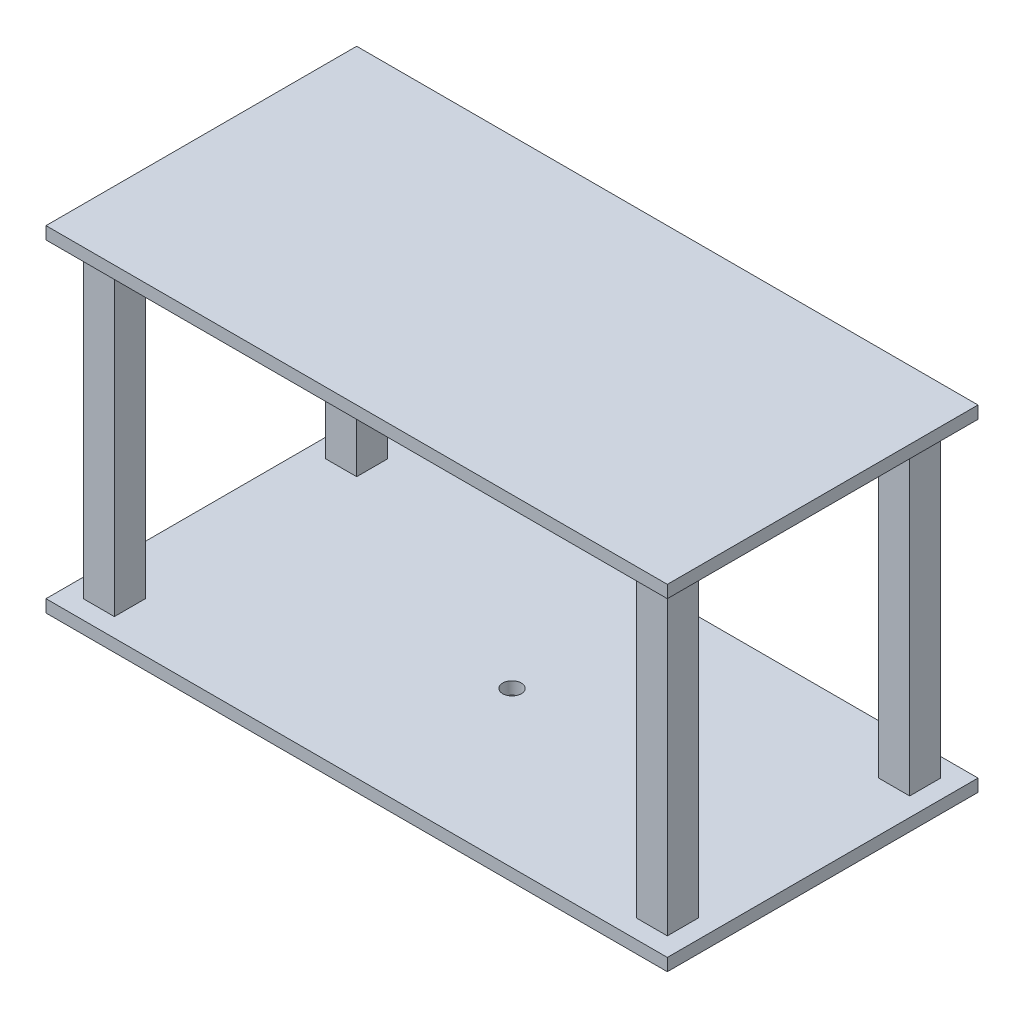
ISO-10303-21;
HEADER;
FILE_DESCRIPTION(('STEP AP214'),'2;1');
FILE_NAME('part.step','',(''),(''),'','','');
FILE_SCHEMA(('AUTOMOTIVE_DESIGN { 1 0 10303 214 1 1 1 1 }'));
ENDSEC;
DATA;
#1=APPLICATION_CONTEXT('core data for automotive mechanical design processes');
#2=APPLICATION_PROTOCOL_DEFINITION('international standard','automotive_design',2000,#1);
#3=PRODUCT_CONTEXT('',#1,'mechanical');
#4=PRODUCT('Part','Part','',(#3));
#5=PRODUCT_RELATED_PRODUCT_CATEGORY('part','',(#4));
#6=PRODUCT_DEFINITION_FORMATION('','',#4);
#7=PRODUCT_DEFINITION_CONTEXT('part definition',#1,'design');
#8=PRODUCT_DEFINITION('design','',#6,#7);
#9=PRODUCT_DEFINITION_SHAPE('','',#8);
#10=(LENGTH_UNIT() NAMED_UNIT(*) SI_UNIT(.MILLI.,.METRE.));
#11=(NAMED_UNIT(*) PLANE_ANGLE_UNIT() SI_UNIT($,.RADIAN.));
#12=(NAMED_UNIT(*) SI_UNIT($,.STERADIAN.) SOLID_ANGLE_UNIT());
#13=UNCERTAINTY_MEASURE_WITH_UNIT(LENGTH_MEASURE(1.E-05),#10,'distance_accuracy_value','');
#14=(GEOMETRIC_REPRESENTATION_CONTEXT(3) GLOBAL_UNCERTAINTY_ASSIGNED_CONTEXT((#13)) GLOBAL_UNIT_ASSIGNED_CONTEXT((#10,
#11,#12)) REPRESENTATION_CONTEXT('',''));
#15=CARTESIAN_POINT('',(0.,0.,0.));
#16=DIRECTION('',(0.,0.,1.));
#17=DIRECTION('',(1.,0.,0.));
#18=AXIS2_PLACEMENT_3D('',#15,#16,#17);
#19=CARTESIAN_POINT('',(0.,2.,0.));
#20=DIRECTION('',(0.,1.,0.));
#21=DIRECTION('',(0.,0.,1.));
#22=AXIS2_PLACEMENT_3D('',#19,#20,#21);
#23=PLANE('',#22);
#24=DIRECTION('',(0.,0.,-1.));
#25=VECTOR('',#24,1.);
#26=CARTESIAN_POINT('',(-47.,2.,22.));
#27=LINE('',#26,#25);
#28=CARTESIAN_POINT('',(-47.,2.,22.));
#29=VERTEX_POINT('',#28);
#30=CARTESIAN_POINT('',(-47.,2.,17.));
#31=VERTEX_POINT('',#30);
#32=EDGE_CURVE('E282',#29,#31,#27,.T.);
#33=ORIENTED_EDGE('',*,*,#32,.T.);
#34=DIRECTION('',(1.,0.,0.));
#35=VECTOR('',#34,1.);
#36=CARTESIAN_POINT('',(-47.,2.,17.));
#37=LINE('',#36,#35);
#38=CARTESIAN_POINT('',(-42.,2.,17.));
#39=VERTEX_POINT('',#38);
#40=EDGE_CURVE('E288',#31,#39,#37,.T.);
#41=ORIENTED_EDGE('',*,*,#40,.T.);
#42=DIRECTION('',(0.,0.,1.));
#43=VECTOR('',#42,1.);
#44=CARTESIAN_POINT('',(-42.,2.,22.));
#45=LINE('',#44,#43);
#46=CARTESIAN_POINT('',(-42.,2.,22.));
#47=VERTEX_POINT('',#46);
#48=EDGE_CURVE('E305',#39,#47,#45,.T.);
#49=ORIENTED_EDGE('',*,*,#48,.T.);
#50=DIRECTION('',(-1.,0.,0.));
#51=VECTOR('',#50,1.);
#52=CARTESIAN_POINT('',(-47.,2.,22.));
#53=LINE('',#52,#51);
#54=EDGE_CURVE('E68',#47,#29,#53,.T.);
#55=ORIENTED_EDGE('',*,*,#54,.T.);
#56=EDGE_LOOP('',(#33,#41,#49,#55));
#57=FACE_BOUND('',#56,.T.);
#58=DIRECTION('',(0.,0.,1.));
#59=VECTOR('',#58,1.);
#60=CARTESIAN_POINT('',(47.,2.,-22.));
#61=LINE('',#60,#59);
#62=CARTESIAN_POINT('',(47.,2.,-22.));
#63=VERTEX_POINT('',#62);
#64=CARTESIAN_POINT('',(47.,2.,-17.));
#65=VERTEX_POINT('',#64);
#66=EDGE_CURVE('E324',#63,#65,#61,.T.);
#67=ORIENTED_EDGE('',*,*,#66,.T.);
#68=DIRECTION('',(-1.,0.,0.));
#69=VECTOR('',#68,1.);
#70=CARTESIAN_POINT('',(47.,2.,-17.));
#71=LINE('',#70,#69);
#72=CARTESIAN_POINT('',(42.,2.,-17.));
#73=VERTEX_POINT('',#72);
#74=EDGE_CURVE('E330',#65,#73,#71,.T.);
#75=ORIENTED_EDGE('',*,*,#74,.T.);
#76=DIRECTION('',(0.,0.,-1.));
#77=VECTOR('',#76,1.);
#78=CARTESIAN_POINT('',(42.,2.,-22.));
#79=LINE('',#78,#77);
#80=CARTESIAN_POINT('',(42.,2.,-22.));
#81=VERTEX_POINT('',#80);
#82=EDGE_CURVE('E348',#73,#81,#79,.T.);
#83=ORIENTED_EDGE('',*,*,#82,.T.);
#84=DIRECTION('',(1.,0.,0.));
#85=VECTOR('',#84,1.);
#86=CARTESIAN_POINT('',(47.,2.,-22.));
#87=LINE('',#86,#85);
#88=EDGE_CURVE('E345',#81,#63,#87,.T.);
#89=ORIENTED_EDGE('',*,*,#88,.T.);
#90=EDGE_LOOP('',(#67,#75,#83,#89));
#91=FACE_BOUND('',#90,.T.);
#92=CARTESIAN_POINT('',(0.,2.,0.));
#93=DIRECTION('',(0.,1.,0.));
#94=DIRECTION('',(0.,0.,1.));
#95=AXIS2_PLACEMENT_3D('',#92,#93,#94);
#96=CIRCLE('',#95,1.5);
#97=CARTESIAN_POINT('',(0.,2.,1.5));
#98=VERTEX_POINT('',#97);
#99=EDGE_CURVE('E412',#98,#98,#96,.T.);
#100=ORIENTED_EDGE('',*,*,#99,.F.);
#101=EDGE_LOOP('',(#100));
#102=FACE_BOUND('',#101,.T.);
#103=DIRECTION('',(0.,0.,1.));
#104=VECTOR('',#103,1.);
#105=CARTESIAN_POINT('',(-50.,2.,-25.));
#106=LINE('',#105,#104);
#107=CARTESIAN_POINT('',(-50.,2.,-25.));
#108=VERTEX_POINT('',#107);
#109=CARTESIAN_POINT('',(-50.,2.,25.));
#110=VERTEX_POINT('',#109);
#111=EDGE_CURVE('E421',#108,#110,#106,.T.);
#112=ORIENTED_EDGE('',*,*,#111,.T.);
#113=DIRECTION('',(1.,0.,0.));
#114=VECTOR('',#113,1.);
#115=CARTESIAN_POINT('',(-50.,2.,25.));
#116=LINE('',#115,#114);
#117=CARTESIAN_POINT('',(50.,2.,25.));
#118=VERTEX_POINT('',#117);
#119=EDGE_CURVE('E425',#110,#118,#116,.T.);
#120=ORIENTED_EDGE('',*,*,#119,.T.);
#121=DIRECTION('',(0.,0.,-1.));
#122=VECTOR('',#121,1.);
#123=CARTESIAN_POINT('',(50.,2.,-25.));
#124=LINE('',#123,#122);
#125=CARTESIAN_POINT('',(50.,2.,-25.));
#126=VERTEX_POINT('',#125);
#127=EDGE_CURVE('E429',#118,#126,#124,.T.);
#128=ORIENTED_EDGE('',*,*,#127,.T.);
#129=DIRECTION('',(-1.,0.,0.));
#130=VECTOR('',#129,1.);
#131=CARTESIAN_POINT('',(-50.,2.,-25.));
#132=LINE('',#131,#130);
#133=EDGE_CURVE('E432',#126,#108,#132,.T.);
#134=ORIENTED_EDGE('',*,*,#133,.T.);
#135=EDGE_LOOP('',(#112,#120,#128,#134));
#136=FACE_BOUND('',#135,.T.);
#137=DIRECTION('',(1.,0.,0.));
#138=VECTOR('',#137,1.);
#139=CARTESIAN_POINT('',(-47.,2.,-17.));
#140=LINE('',#139,#138);
#141=CARTESIAN_POINT('',(-47.,2.,-17.));
#142=VERTEX_POINT('',#141);
#143=CARTESIAN_POINT('',(-42.,2.,-17.));
#144=VERTEX_POINT('',#143);
#145=EDGE_CURVE('E390',#142,#144,#140,.T.);
#146=ORIENTED_EDGE('',*,*,#145,.F.);
#147=DIRECTION('',(0.,0.,1.));
#148=VECTOR('',#147,1.);
#149=CARTESIAN_POINT('',(-47.,2.,-22.));
#150=LINE('',#149,#148);
#151=CARTESIAN_POINT('',(-47.,2.,-22.));
#152=VERTEX_POINT('',#151);
#153=EDGE_CURVE('E368',#152,#142,#150,.T.);
#154=ORIENTED_EDGE('',*,*,#153,.F.);
#155=DIRECTION('',(-1.,0.,0.));
#156=VECTOR('',#155,1.);
#157=CARTESIAN_POINT('',(-47.,2.,-22.));
#158=LINE('',#157,#156);
#159=CARTESIAN_POINT('',(-42.,2.,-22.));
#160=VERTEX_POINT('',#159);
#161=EDGE_CURVE('E374',#160,#152,#158,.T.);
#162=ORIENTED_EDGE('',*,*,#161,.F.);
#163=DIRECTION('',(0.,0.,-1.));
#164=VECTOR('',#163,1.);
#165=CARTESIAN_POINT('',(-42.,2.,-22.));
#166=LINE('',#165,#164);
#167=EDGE_CURVE('E393',#144,#160,#166,.T.);
#168=ORIENTED_EDGE('',*,*,#167,.F.);
#169=EDGE_LOOP('',(#146,#154,#162,#168));
#170=FACE_BOUND('',#169,.T.);
#171=DIRECTION('',(-1.,0.,0.));
#172=VECTOR('',#171,1.);
#173=CARTESIAN_POINT('',(47.,2.,17.));
#174=LINE('',#173,#172);
#175=CARTESIAN_POINT('',(47.,2.,17.));
#176=VERTEX_POINT('',#175);
#177=CARTESIAN_POINT('',(42.,2.,17.));
#178=VERTEX_POINT('',#177);
#179=EDGE_CURVE('E239',#176,#178,#174,.T.);
#180=ORIENTED_EDGE('',*,*,#179,.F.);
#181=DIRECTION('',(0.,0.,-1.));
#182=VECTOR('',#181,1.);
#183=CARTESIAN_POINT('',(47.,2.,22.));
#184=LINE('',#183,#182);
#185=CARTESIAN_POINT('',(47.,2.,22.));
#186=VERTEX_POINT('',#185);
#187=EDGE_CURVE('E234',#186,#176,#184,.T.);
#188=ORIENTED_EDGE('',*,*,#187,.F.);
#189=DIRECTION('',(1.,0.,0.));
#190=VECTOR('',#189,1.);
#191=CARTESIAN_POINT('',(47.,2.,22.));
#192=LINE('',#191,#190);
#193=CARTESIAN_POINT('',(42.,2.,22.));
#194=VERTEX_POINT('',#193);
#195=EDGE_CURVE('E250',#194,#186,#192,.T.);
#196=ORIENTED_EDGE('',*,*,#195,.F.);
#197=DIRECTION('',(0.,0.,1.));
#198=VECTOR('',#197,1.);
#199=CARTESIAN_POINT('',(42.,2.,22.));
#200=LINE('',#199,#198);
#201=EDGE_CURVE('E265',#178,#194,#200,.T.);
#202=ORIENTED_EDGE('',*,*,#201,.F.);
#203=EDGE_LOOP('',(#180,#188,#196,#202));
#204=FACE_BOUND('',#203,.T.);
#205=ADVANCED_FACE('F44',(#57,#91,#102,#136,#170,#204),#23,.T.);
#206=CARTESIAN_POINT('',(-50.,2.,-25.));
#207=DIRECTION('',(1.,0.,0.));
#208=DIRECTION('',(0.,0.,-1.));
#209=AXIS2_PLACEMENT_3D('',#206,#207,#208);
#210=PLANE('',#209);
#211=DIRECTION('',(0.,0.,1.));
#212=VECTOR('',#211,1.);
#213=CARTESIAN_POINT('',(-50.,0.,-25.));
#214=LINE('',#213,#212);
#215=CARTESIAN_POINT('',(-50.,0.,-25.));
#216=VERTEX_POINT('',#215);
#217=CARTESIAN_POINT('',(-50.,0.,25.));
#218=VERTEX_POINT('',#217);
#219=EDGE_CURVE('E420',#216,#218,#214,.T.);
#220=ORIENTED_EDGE('',*,*,#219,.T.);
#221=DIRECTION('',(0.,-1.,0.));
#222=VECTOR('',#221,1.);
#223=CARTESIAN_POINT('',(-50.,2.,25.));
#224=LINE('',#223,#222);
#225=EDGE_CURVE('E11',#110,#218,#224,.T.);
#226=ORIENTED_EDGE('',*,*,#225,.F.);
#227=ORIENTED_EDGE('',*,*,#111,.F.);
#228=DIRECTION('',(0.,-1.,0.));
#229=VECTOR('',#228,1.);
#230=CARTESIAN_POINT('',(-50.,2.,-25.));
#231=LINE('',#230,#229);
#232=EDGE_CURVE('E435',#108,#216,#231,.T.);
#233=ORIENTED_EDGE('',*,*,#232,.T.);
#234=EDGE_LOOP('',(#220,#226,#227,#233));
#235=FACE_BOUND('',#234,.T.);
#236=ADVANCED_FACE('F46',(#235),#210,.F.);
#237=CARTESIAN_POINT('',(-50.,2.,25.));
#238=DIRECTION('',(0.,0.,-1.));
#239=DIRECTION('',(-1.,0.,0.));
#240=AXIS2_PLACEMENT_3D('',#237,#238,#239);
#241=PLANE('',#240);
#242=DIRECTION('',(1.,0.,0.));
#243=VECTOR('',#242,1.);
#244=CARTESIAN_POINT('',(-50.,0.,25.));
#245=LINE('',#244,#243);
#246=CARTESIAN_POINT('',(50.,0.,25.));
#247=VERTEX_POINT('',#246);
#248=EDGE_CURVE('E439',#218,#247,#245,.T.);
#249=ORIENTED_EDGE('',*,*,#248,.T.);
#250=DIRECTION('',(0.,-1.,0.));
#251=VECTOR('',#250,1.);
#252=CARTESIAN_POINT('',(50.,2.,25.));
#253=LINE('',#252,#251);
#254=EDGE_CURVE('E53',#118,#247,#253,.T.);
#255=ORIENTED_EDGE('',*,*,#254,.F.);
#256=ORIENTED_EDGE('',*,*,#119,.F.);
#257=ORIENTED_EDGE('',*,*,#225,.T.);
#258=EDGE_LOOP('',(#249,#255,#256,#257));
#259=FACE_BOUND('',#258,.T.);
#260=ADVANCED_FACE('F475',(#259),#241,.F.);
#261=CARTESIAN_POINT('',(50.,2.,-25.));
#262=DIRECTION('',(-1.,0.,0.));
#263=DIRECTION('',(0.,0.,1.));
#264=AXIS2_PLACEMENT_3D('',#261,#262,#263);
#265=PLANE('',#264);
#266=DIRECTION('',(0.,0.,-1.));
#267=VECTOR('',#266,1.);
#268=CARTESIAN_POINT('',(50.,0.,-25.));
#269=LINE('',#268,#267);
#270=CARTESIAN_POINT('',(50.,0.,-25.));
#271=VERTEX_POINT('',#270);
#272=EDGE_CURVE('E442',#247,#271,#269,.T.);
#273=ORIENTED_EDGE('',*,*,#272,.T.);
#274=DIRECTION('',(0.,-1.,0.));
#275=VECTOR('',#274,1.);
#276=CARTESIAN_POINT('',(50.,2.,-25.));
#277=LINE('',#276,#275);
#278=EDGE_CURVE('E450',#126,#271,#277,.T.);
#279=ORIENTED_EDGE('',*,*,#278,.F.);
#280=ORIENTED_EDGE('',*,*,#127,.F.);
#281=ORIENTED_EDGE('',*,*,#254,.T.);
#282=EDGE_LOOP('',(#273,#279,#280,#281));
#283=FACE_BOUND('',#282,.T.);
#284=ADVANCED_FACE('F459',(#283),#265,.F.);
#285=CARTESIAN_POINT('',(-50.,2.,-25.));
#286=DIRECTION('',(0.,0.,1.));
#287=DIRECTION('',(1.,0.,0.));
#288=AXIS2_PLACEMENT_3D('',#285,#286,#287);
#289=PLANE('',#288);
#290=DIRECTION('',(-1.,0.,0.));
#291=VECTOR('',#290,1.);
#292=CARTESIAN_POINT('',(-50.,0.,-25.));
#293=LINE('',#292,#291);
#294=EDGE_CURVE('E426',#271,#216,#293,.T.);
#295=ORIENTED_EDGE('',*,*,#294,.T.);
#296=ORIENTED_EDGE('',*,*,#232,.F.);
#297=ORIENTED_EDGE('',*,*,#133,.F.);
#298=ORIENTED_EDGE('',*,*,#278,.T.);
#299=EDGE_LOOP('',(#295,#296,#297,#298));
#300=FACE_BOUND('',#299,.T.);
#301=ADVANCED_FACE('F468',(#300),#289,.F.);
#302=CARTESIAN_POINT('',(0.,0.,0.));
#303=DIRECTION('',(0.,1.,0.));
#304=DIRECTION('',(0.,0.,1.));
#305=AXIS2_PLACEMENT_3D('',#302,#303,#304);
#306=PLANE('',#305);
#307=CARTESIAN_POINT('',(0.,0.,0.));
#308=DIRECTION('',(0.,1.,0.));
#309=DIRECTION('',(0.,0.,1.));
#310=AXIS2_PLACEMENT_3D('',#307,#308,#309);
#311=CIRCLE('',#310,1.5);
#312=CARTESIAN_POINT('',(0.,0.,1.5));
#313=VERTEX_POINT('',#312);
#314=EDGE_CURVE('E416',#313,#313,#311,.F.);
#315=ORIENTED_EDGE('',*,*,#314,.F.);
#316=EDGE_LOOP('',(#315));
#317=FACE_BOUND('',#316,.T.);
#318=ORIENTED_EDGE('',*,*,#219,.F.);
#319=ORIENTED_EDGE('',*,*,#294,.F.);
#320=ORIENTED_EDGE('',*,*,#272,.F.);
#321=ORIENTED_EDGE('',*,*,#248,.F.);
#322=EDGE_LOOP('',(#318,#319,#320,#321));
#323=FACE_BOUND('',#322,.T.);
#324=ADVANCED_FACE('F465',(#317,#323),#306,.F.);
#325=CARTESIAN_POINT('',(0.,-0.00100000000000013,0.));
#326=DIRECTION('',(0.,1.,0.));
#327=DIRECTION('',(0.,0.,1.));
#328=AXIS2_PLACEMENT_3D('',#325,#326,#327);
#329=CYLINDRICAL_SURFACE('',#328,1.5);
#330=ORIENTED_EDGE('',*,*,#99,.T.);
#331=EDGE_LOOP('',(#330));
#332=FACE_BOUND('',#331,.T.);
#333=ORIENTED_EDGE('',*,*,#314,.T.);
#334=EDGE_LOOP('',(#333));
#335=FACE_BOUND('',#334,.T.);
#336=ADVANCED_FACE('F491',(#332,#335),#329,.F.);
#337=CARTESIAN_POINT('',(-47.,52.,-22.));
#338=DIRECTION('',(1.,0.,0.));
#339=DIRECTION('',(0.,0.,-1.));
#340=AXIS2_PLACEMENT_3D('',#337,#338,#339);
#341=PLANE('',#340);
#342=ORIENTED_EDGE('',*,*,#153,.T.);
#343=DIRECTION('',(0.,-1.,0.));
#344=VECTOR('',#343,1.);
#345=CARTESIAN_POINT('',(-47.,52.,-17.));
#346=LINE('',#345,#344);
#347=CARTESIAN_POINT('',(-47.,52.,-17.));
#348=VERTEX_POINT('',#347);
#349=EDGE_CURVE('E409',#348,#142,#346,.T.);
#350=ORIENTED_EDGE('',*,*,#349,.F.);
#351=DIRECTION('',(0.,0.,1.));
#352=VECTOR('',#351,1.);
#353=CARTESIAN_POINT('',(-47.,52.,-22.));
#354=LINE('',#353,#352);
#355=CARTESIAN_POINT('',(-47.,52.,-22.));
#356=VERTEX_POINT('',#355);
#357=EDGE_CURVE('E369',#356,#348,#354,.T.);
#358=ORIENTED_EDGE('',*,*,#357,.F.);
#359=DIRECTION('',(0.,-1.,0.));
#360=VECTOR('',#359,1.);
#361=CARTESIAN_POINT('',(-47.,52.,-22.));
#362=LINE('',#361,#360);
#363=EDGE_CURVE('E386',#356,#152,#362,.T.);
#364=ORIENTED_EDGE('',*,*,#363,.T.);
#365=EDGE_LOOP('',(#342,#350,#358,#364));
#366=FACE_BOUND('',#365,.T.);
#367=ADVANCED_FACE('F511',(#366),#341,.F.);
#368=CARTESIAN_POINT('',(-47.,52.,-17.));
#369=DIRECTION('',(0.,0.,-1.));
#370=DIRECTION('',(-1.,0.,0.));
#371=AXIS2_PLACEMENT_3D('',#368,#369,#370);
#372=PLANE('',#371);
#373=ORIENTED_EDGE('',*,*,#145,.T.);
#374=DIRECTION('',(0.,-1.,0.));
#375=VECTOR('',#374,1.);
#376=CARTESIAN_POINT('',(-42.,52.,-17.));
#377=LINE('',#376,#375);
#378=CARTESIAN_POINT('',(-42.,52.,-17.));
#379=VERTEX_POINT('',#378);
#380=EDGE_CURVE('E405',#379,#144,#377,.T.);
#381=ORIENTED_EDGE('',*,*,#380,.F.);
#382=DIRECTION('',(1.,0.,0.));
#383=VECTOR('',#382,1.);
#384=CARTESIAN_POINT('',(-47.,52.,-17.));
#385=LINE('',#384,#383);
#386=EDGE_CURVE('E373',#348,#379,#385,.T.);
#387=ORIENTED_EDGE('',*,*,#386,.F.);
#388=ORIENTED_EDGE('',*,*,#349,.T.);
#389=EDGE_LOOP('',(#373,#381,#387,#388));
#390=FACE_BOUND('',#389,.T.);
#391=ADVANCED_FACE('F522',(#390),#372,.F.);
#392=CARTESIAN_POINT('',(-42.,52.,-22.));
#393=DIRECTION('',(-1.,0.,0.));
#394=DIRECTION('',(0.,0.,1.));
#395=AXIS2_PLACEMENT_3D('',#392,#393,#394);
#396=PLANE('',#395);
#397=ORIENTED_EDGE('',*,*,#167,.T.);
#398=DIRECTION('',(0.,-1.,0.));
#399=VECTOR('',#398,1.);
#400=CARTESIAN_POINT('',(-42.,52.,-22.));
#401=LINE('',#400,#399);
#402=CARTESIAN_POINT('',(-42.,52.,-22.));
#403=VERTEX_POINT('',#402);
#404=EDGE_CURVE('E402',#403,#160,#401,.T.);
#405=ORIENTED_EDGE('',*,*,#404,.F.);
#406=DIRECTION('',(0.,0.,-1.));
#407=VECTOR('',#406,1.);
#408=CARTESIAN_POINT('',(-42.,52.,-22.));
#409=LINE('',#408,#407);
#410=EDGE_CURVE('E378',#379,#403,#409,.T.);
#411=ORIENTED_EDGE('',*,*,#410,.F.);
#412=ORIENTED_EDGE('',*,*,#380,.T.);
#413=EDGE_LOOP('',(#397,#405,#411,#412));
#414=FACE_BOUND('',#413,.T.);
#415=ADVANCED_FACE('F531',(#414),#396,.F.);
#416=CARTESIAN_POINT('',(-47.,52.,-22.));
#417=DIRECTION('',(0.,0.,1.));
#418=DIRECTION('',(1.,0.,0.));
#419=AXIS2_PLACEMENT_3D('',#416,#417,#418);
#420=PLANE('',#419);
#421=ORIENTED_EDGE('',*,*,#161,.T.);
#422=ORIENTED_EDGE('',*,*,#363,.F.);
#423=DIRECTION('',(-1.,0.,0.));
#424=VECTOR('',#423,1.);
#425=CARTESIAN_POINT('',(-47.,52.,-22.));
#426=LINE('',#425,#424);
#427=EDGE_CURVE('E382',#403,#356,#426,.T.);
#428=ORIENTED_EDGE('',*,*,#427,.F.);
#429=ORIENTED_EDGE('',*,*,#404,.T.);
#430=EDGE_LOOP('',(#421,#422,#428,#429));
#431=FACE_BOUND('',#430,.T.);
#432=ADVANCED_FACE('F541',(#431),#420,.F.);
#433=CARTESIAN_POINT('',(47.,52.,-22.));
#434=DIRECTION('',(1.,0.,0.));
#435=DIRECTION('',(0.,0.,-1.));
#436=AXIS2_PLACEMENT_3D('',#433,#434,#435);
#437=PLANE('',#436);
#438=ORIENTED_EDGE('',*,*,#66,.F.);
#439=DIRECTION('',(0.,-1.,0.));
#440=VECTOR('',#439,1.);
#441=CARTESIAN_POINT('',(47.,52.,-22.));
#442=LINE('',#441,#440);
#443=CARTESIAN_POINT('',(47.,52.,-22.));
#444=VERTEX_POINT('',#443);
#445=EDGE_CURVE('E364',#444,#63,#442,.T.);
#446=ORIENTED_EDGE('',*,*,#445,.F.);
#447=DIRECTION('',(0.,0.,1.));
#448=VECTOR('',#447,1.);
#449=CARTESIAN_POINT('',(47.,52.,-22.));
#450=LINE('',#449,#448);
#451=CARTESIAN_POINT('',(47.,52.,-17.));
#452=VERTEX_POINT('',#451);
#453=EDGE_CURVE('E325',#444,#452,#450,.T.);
#454=ORIENTED_EDGE('',*,*,#453,.T.);
#455=DIRECTION('',(0.,-1.,0.));
#456=VECTOR('',#455,1.);
#457=CARTESIAN_POINT('',(47.,52.,-17.));
#458=LINE('',#457,#456);
#459=EDGE_CURVE('E342',#452,#65,#458,.T.);
#460=ORIENTED_EDGE('',*,*,#459,.T.);
#461=EDGE_LOOP('',(#438,#446,#454,#460));
#462=FACE_BOUND('',#461,.T.);
#463=ADVANCED_FACE('F550',(#462),#437,.T.);
#464=CARTESIAN_POINT('',(47.,52.,-22.));
#465=DIRECTION('',(0.,0.,-1.));
#466=DIRECTION('',(-1.,0.,0.));
#467=AXIS2_PLACEMENT_3D('',#464,#465,#466);
#468=PLANE('',#467);
#469=ORIENTED_EDGE('',*,*,#88,.F.);
#470=DIRECTION('',(0.,-1.,0.));
#471=VECTOR('',#470,1.);
#472=CARTESIAN_POINT('',(42.,52.,-22.));
#473=LINE('',#472,#471);
#474=CARTESIAN_POINT('',(42.,52.,-22.));
#475=VERTEX_POINT('',#474);
#476=EDGE_CURVE('E360',#475,#81,#473,.T.);
#477=ORIENTED_EDGE('',*,*,#476,.F.);
#478=DIRECTION('',(1.,0.,0.));
#479=VECTOR('',#478,1.);
#480=CARTESIAN_POINT('',(47.,52.,-22.));
#481=LINE('',#480,#479);
#482=EDGE_CURVE('E329',#475,#444,#481,.T.);
#483=ORIENTED_EDGE('',*,*,#482,.T.);
#484=ORIENTED_EDGE('',*,*,#445,.T.);
#485=EDGE_LOOP('',(#469,#477,#483,#484));
#486=FACE_BOUND('',#485,.T.);
#487=ADVANCED_FACE('F565',(#486),#468,.T.);
#488=CARTESIAN_POINT('',(42.,52.,-22.));
#489=DIRECTION('',(-1.,0.,0.));
#490=DIRECTION('',(0.,0.,1.));
#491=AXIS2_PLACEMENT_3D('',#488,#489,#490);
#492=PLANE('',#491);
#493=ORIENTED_EDGE('',*,*,#82,.F.);
#494=DIRECTION('',(0.,-1.,0.));
#495=VECTOR('',#494,1.);
#496=CARTESIAN_POINT('',(42.,52.,-17.));
#497=LINE('',#496,#495);
#498=CARTESIAN_POINT('',(42.,52.,-17.));
#499=VERTEX_POINT('',#498);
#500=EDGE_CURVE('E356',#499,#73,#497,.T.);
#501=ORIENTED_EDGE('',*,*,#500,.F.);
#502=DIRECTION('',(0.,0.,-1.));
#503=VECTOR('',#502,1.);
#504=CARTESIAN_POINT('',(42.,52.,-22.));
#505=LINE('',#504,#503);
#506=EDGE_CURVE('E334',#499,#475,#505,.T.);
#507=ORIENTED_EDGE('',*,*,#506,.T.);
#508=ORIENTED_EDGE('',*,*,#476,.T.);
#509=EDGE_LOOP('',(#493,#501,#507,#508));
#510=FACE_BOUND('',#509,.T.);
#511=ADVANCED_FACE('F575',(#510),#492,.T.);
#512=CARTESIAN_POINT('',(47.,52.,-17.));
#513=DIRECTION('',(0.,0.,1.));
#514=DIRECTION('',(1.,0.,0.));
#515=AXIS2_PLACEMENT_3D('',#512,#513,#514);
#516=PLANE('',#515);
#517=ORIENTED_EDGE('',*,*,#74,.F.);
#518=ORIENTED_EDGE('',*,*,#459,.F.);
#519=DIRECTION('',(-1.,0.,0.));
#520=VECTOR('',#519,1.);
#521=CARTESIAN_POINT('',(47.,52.,-17.));
#522=LINE('',#521,#520);
#523=EDGE_CURVE('E338',#452,#499,#522,.T.);
#524=ORIENTED_EDGE('',*,*,#523,.T.);
#525=ORIENTED_EDGE('',*,*,#500,.T.);
#526=EDGE_LOOP('',(#517,#518,#524,#525));
#527=FACE_BOUND('',#526,.T.);
#528=ADVANCED_FACE('F585',(#527),#516,.T.);
#529=CARTESIAN_POINT('',(-47.,52.,22.));
#530=DIRECTION('',(-1.,0.,0.));
#531=DIRECTION('',(0.,0.,1.));
#532=AXIS2_PLACEMENT_3D('',#529,#530,#531);
#533=PLANE('',#532);
#534=ORIENTED_EDGE('',*,*,#32,.F.);
#535=DIRECTION('',(0.,-1.,0.));
#536=VECTOR('',#535,1.);
#537=CARTESIAN_POINT('',(-47.,52.,22.));
#538=LINE('',#537,#536);
#539=CARTESIAN_POINT('',(-47.,52.,22.));
#540=VERTEX_POINT('',#539);
#541=EDGE_CURVE('E321',#540,#29,#538,.T.);
#542=ORIENTED_EDGE('',*,*,#541,.F.);
#543=DIRECTION('',(0.,0.,-1.));
#544=VECTOR('',#543,1.);
#545=CARTESIAN_POINT('',(-47.,52.,22.));
#546=LINE('',#545,#544);
#547=CARTESIAN_POINT('',(-47.,52.,17.));
#548=VERTEX_POINT('',#547);
#549=EDGE_CURVE('E283',#540,#548,#546,.T.);
#550=ORIENTED_EDGE('',*,*,#549,.T.);
#551=DIRECTION('',(0.,-1.,0.));
#552=VECTOR('',#551,1.);
#553=CARTESIAN_POINT('',(-47.,52.,17.));
#554=LINE('',#553,#552);
#555=EDGE_CURVE('E300',#548,#31,#554,.T.);
#556=ORIENTED_EDGE('',*,*,#555,.T.);
#557=EDGE_LOOP('',(#534,#542,#550,#556));
#558=FACE_BOUND('',#557,.T.);
#559=ADVANCED_FACE('F595',(#558),#533,.T.);
#560=CARTESIAN_POINT('',(-47.,52.,22.));
#561=DIRECTION('',(0.,0.,1.));
#562=DIRECTION('',(1.,0.,0.));
#563=AXIS2_PLACEMENT_3D('',#560,#561,#562);
#564=PLANE('',#563);
#565=ORIENTED_EDGE('',*,*,#54,.F.);
#566=DIRECTION('',(0.,-1.,0.));
#567=VECTOR('',#566,1.);
#568=CARTESIAN_POINT('',(-42.,52.,22.));
#569=LINE('',#568,#567);
#570=CARTESIAN_POINT('',(-42.,52.,22.));
#571=VERTEX_POINT('',#570);
#572=EDGE_CURVE('E317',#571,#47,#569,.T.);
#573=ORIENTED_EDGE('',*,*,#572,.F.);
#574=DIRECTION('',(-1.,0.,0.));
#575=VECTOR('',#574,1.);
#576=CARTESIAN_POINT('',(-47.,52.,22.));
#577=LINE('',#576,#575);
#578=EDGE_CURVE('E287',#571,#540,#577,.T.);
#579=ORIENTED_EDGE('',*,*,#578,.T.);
#580=ORIENTED_EDGE('',*,*,#541,.T.);
#581=EDGE_LOOP('',(#565,#573,#579,#580));
#582=FACE_BOUND('',#581,.T.);
#583=ADVANCED_FACE('F605',(#582),#564,.T.);
#584=CARTESIAN_POINT('',(-42.,52.,22.));
#585=DIRECTION('',(1.,0.,0.));
#586=DIRECTION('',(0.,0.,-1.));
#587=AXIS2_PLACEMENT_3D('',#584,#585,#586);
#588=PLANE('',#587);
#589=ORIENTED_EDGE('',*,*,#48,.F.);
#590=DIRECTION('',(0.,-1.,0.));
#591=VECTOR('',#590,1.);
#592=CARTESIAN_POINT('',(-42.,52.,17.));
#593=LINE('',#592,#591);
#594=CARTESIAN_POINT('',(-42.,52.,17.));
#595=VERTEX_POINT('',#594);
#596=EDGE_CURVE('E313',#595,#39,#593,.T.);
#597=ORIENTED_EDGE('',*,*,#596,.F.);
#598=DIRECTION('',(0.,0.,1.));
#599=VECTOR('',#598,1.);
#600=CARTESIAN_POINT('',(-42.,52.,22.));
#601=LINE('',#600,#599);
#602=EDGE_CURVE('E292',#595,#571,#601,.T.);
#603=ORIENTED_EDGE('',*,*,#602,.T.);
#604=ORIENTED_EDGE('',*,*,#572,.T.);
#605=EDGE_LOOP('',(#589,#597,#603,#604));
#606=FACE_BOUND('',#605,.T.);
#607=ADVANCED_FACE('F615',(#606),#588,.T.);
#608=CARTESIAN_POINT('',(-47.,52.,17.));
#609=DIRECTION('',(0.,0.,-1.));
#610=DIRECTION('',(-1.,0.,0.));
#611=AXIS2_PLACEMENT_3D('',#608,#609,#610);
#612=PLANE('',#611);
#613=ORIENTED_EDGE('',*,*,#40,.F.);
#614=ORIENTED_EDGE('',*,*,#555,.F.);
#615=DIRECTION('',(1.,0.,0.));
#616=VECTOR('',#615,1.);
#617=CARTESIAN_POINT('',(-47.,52.,17.));
#618=LINE('',#617,#616);
#619=EDGE_CURVE('E296',#548,#595,#618,.T.);
#620=ORIENTED_EDGE('',*,*,#619,.T.);
#621=ORIENTED_EDGE('',*,*,#596,.T.);
#622=EDGE_LOOP('',(#613,#614,#620,#621));
#623=FACE_BOUND('',#622,.T.);
#624=ADVANCED_FACE('F625',(#623),#612,.T.);
#625=CARTESIAN_POINT('',(47.,52.,22.));
#626=DIRECTION('',(-1.,0.,0.));
#627=DIRECTION('',(0.,0.,1.));
#628=AXIS2_PLACEMENT_3D('',#625,#626,#627);
#629=PLANE('',#628);
#630=ORIENTED_EDGE('',*,*,#187,.T.);
#631=DIRECTION('',(0.,-1.,0.));
#632=VECTOR('',#631,1.);
#633=CARTESIAN_POINT('',(47.,52.,17.));
#634=LINE('',#633,#632);
#635=CARTESIAN_POINT('',(47.,52.,17.));
#636=VERTEX_POINT('',#635);
#637=EDGE_CURVE('E279',#636,#176,#634,.T.);
#638=ORIENTED_EDGE('',*,*,#637,.F.);
#639=DIRECTION('',(0.,0.,-1.));
#640=VECTOR('',#639,1.);
#641=CARTESIAN_POINT('',(47.,52.,22.));
#642=LINE('',#641,#640);
#643=CARTESIAN_POINT('',(47.,52.,22.));
#644=VERTEX_POINT('',#643);
#645=EDGE_CURVE('E245',#644,#636,#642,.T.);
#646=ORIENTED_EDGE('',*,*,#645,.F.);
#647=DIRECTION('',(0.,-1.,0.));
#648=VECTOR('',#647,1.);
#649=CARTESIAN_POINT('',(47.,52.,22.));
#650=LINE('',#649,#648);
#651=EDGE_CURVE('E261',#644,#186,#650,.T.);
#652=ORIENTED_EDGE('',*,*,#651,.T.);
#653=EDGE_LOOP('',(#630,#638,#646,#652));
#654=FACE_BOUND('',#653,.T.);
#655=ADVANCED_FACE('F635',(#654),#629,.F.);
#656=CARTESIAN_POINT('',(47.,52.,17.));
#657=DIRECTION('',(0.,0.,1.));
#658=DIRECTION('',(1.,0.,0.));
#659=AXIS2_PLACEMENT_3D('',#656,#657,#658);
#660=PLANE('',#659);
#661=ORIENTED_EDGE('',*,*,#179,.T.);
#662=DIRECTION('',(0.,-1.,0.));
#663=VECTOR('',#662,1.);
#664=CARTESIAN_POINT('',(42.,52.,17.));
#665=LINE('',#664,#663);
#666=CARTESIAN_POINT('',(42.,52.,17.));
#667=VERTEX_POINT('',#666);
#668=EDGE_CURVE('E275',#667,#178,#665,.T.);
#669=ORIENTED_EDGE('',*,*,#668,.F.);
#670=DIRECTION('',(-1.,0.,0.));
#671=VECTOR('',#670,1.);
#672=CARTESIAN_POINT('',(47.,52.,17.));
#673=LINE('',#672,#671);
#674=EDGE_CURVE('E249',#636,#667,#673,.T.);
#675=ORIENTED_EDGE('',*,*,#674,.F.);
#676=ORIENTED_EDGE('',*,*,#637,.T.);
#677=EDGE_LOOP('',(#661,#669,#675,#676));
#678=FACE_BOUND('',#677,.T.);
#679=ADVANCED_FACE('F645',(#678),#660,.F.);
#680=CARTESIAN_POINT('',(42.,52.,22.));
#681=DIRECTION('',(1.,0.,0.));
#682=DIRECTION('',(0.,0.,-1.));
#683=AXIS2_PLACEMENT_3D('',#680,#681,#682);
#684=PLANE('',#683);
#685=ORIENTED_EDGE('',*,*,#201,.T.);
#686=DIRECTION('',(0.,-1.,0.));
#687=VECTOR('',#686,1.);
#688=CARTESIAN_POINT('',(42.,52.,22.));
#689=LINE('',#688,#687);
#690=CARTESIAN_POINT('',(42.,52.,22.));
#691=VERTEX_POINT('',#690);
#692=EDGE_CURVE('E60',#691,#194,#689,.T.);
#693=ORIENTED_EDGE('',*,*,#692,.F.);
#694=DIRECTION('',(0.,0.,1.));
#695=VECTOR('',#694,1.);
#696=CARTESIAN_POINT('',(42.,52.,22.));
#697=LINE('',#696,#695);
#698=EDGE_CURVE('E254',#667,#691,#697,.T.);
#699=ORIENTED_EDGE('',*,*,#698,.F.);
#700=ORIENTED_EDGE('',*,*,#668,.T.);
#701=EDGE_LOOP('',(#685,#693,#699,#700));
#702=FACE_BOUND('',#701,.T.);
#703=ADVANCED_FACE('F655',(#702),#684,.F.);
#704=CARTESIAN_POINT('',(47.,52.,22.));
#705=DIRECTION('',(0.,0.,-1.));
#706=DIRECTION('',(-1.,0.,0.));
#707=AXIS2_PLACEMENT_3D('',#704,#705,#706);
#708=PLANE('',#707);
#709=ORIENTED_EDGE('',*,*,#195,.T.);
#710=ORIENTED_EDGE('',*,*,#651,.F.);
#711=DIRECTION('',(1.,0.,0.));
#712=VECTOR('',#711,1.);
#713=CARTESIAN_POINT('',(47.,52.,22.));
#714=LINE('',#713,#712);
#715=EDGE_CURVE('E258',#691,#644,#714,.T.);
#716=ORIENTED_EDGE('',*,*,#715,.F.);
#717=ORIENTED_EDGE('',*,*,#692,.T.);
#718=EDGE_LOOP('',(#709,#710,#716,#717));
#719=FACE_BOUND('',#718,.T.);
#720=ADVANCED_FACE('F665',(#719),#708,.F.);
#721=CARTESIAN_POINT('',(0.,52.,0.));
#722=DIRECTION('',(0.,1.,0.));
#723=DIRECTION('',(0.,0.,1.));
#724=AXIS2_PLACEMENT_3D('',#721,#722,#723);
#725=PLANE('',#724);
#726=ORIENTED_EDGE('',*,*,#453,.F.);
#727=ORIENTED_EDGE('',*,*,#482,.F.);
#728=ORIENTED_EDGE('',*,*,#506,.F.);
#729=ORIENTED_EDGE('',*,*,#523,.F.);
#730=EDGE_LOOP('',(#726,#727,#728,#729));
#731=FACE_BOUND('',#730,.T.);
#732=ORIENTED_EDGE('',*,*,#549,.F.);
#733=ORIENTED_EDGE('',*,*,#578,.F.);
#734=ORIENTED_EDGE('',*,*,#602,.F.);
#735=ORIENTED_EDGE('',*,*,#619,.F.);
#736=EDGE_LOOP('',(#732,#733,#734,#735));
#737=FACE_BOUND('',#736,.T.);
#738=DIRECTION('',(0.,0.,1.));
#739=VECTOR('',#738,1.);
#740=CARTESIAN_POINT('',(-50.,52.,-25.));
#741=LINE('',#740,#739);
#742=CARTESIAN_POINT('',(-50.,52.,-25.));
#743=VERTEX_POINT('',#742);
#744=CARTESIAN_POINT('',(-50.,52.,25.));
#745=VERTEX_POINT('',#744);
#746=EDGE_CURVE('E232',#743,#745,#741,.T.);
#747=ORIENTED_EDGE('',*,*,#746,.F.);
#748=DIRECTION('',(-1.,0.,0.));
#749=VECTOR('',#748,1.);
#750=CARTESIAN_POINT('',(-50.,52.,-25.));
#751=LINE('',#750,#749);
#752=CARTESIAN_POINT('',(50.,52.,-25.));
#753=VERTEX_POINT('',#752);
#754=EDGE_CURVE('E228',#753,#743,#751,.T.);
#755=ORIENTED_EDGE('',*,*,#754,.F.);
#756=DIRECTION('',(0.,0.,-1.));
#757=VECTOR('',#756,1.);
#758=CARTESIAN_POINT('',(50.,52.,-25.));
#759=LINE('',#758,#757);
#760=CARTESIAN_POINT('',(50.,52.,25.));
#761=VERTEX_POINT('',#760);
#762=EDGE_CURVE('E738',#761,#753,#759,.T.);
#763=ORIENTED_EDGE('',*,*,#762,.F.);
#764=DIRECTION('',(1.,0.,0.));
#765=VECTOR('',#764,1.);
#766=CARTESIAN_POINT('',(-50.,52.,25.));
#767=LINE('',#766,#765);
#768=EDGE_CURVE('E743',#745,#761,#767,.T.);
#769=ORIENTED_EDGE('',*,*,#768,.F.);
#770=EDGE_LOOP('',(#747,#755,#763,#769));
#771=FACE_BOUND('',#770,.T.);
#772=ORIENTED_EDGE('',*,*,#715,.T.);
#773=ORIENTED_EDGE('',*,*,#645,.T.);
#774=ORIENTED_EDGE('',*,*,#674,.T.);
#775=ORIENTED_EDGE('',*,*,#698,.T.);
#776=EDGE_LOOP('',(#772,#773,#774,#775));
#777=FACE_BOUND('',#776,.T.);
#778=ORIENTED_EDGE('',*,*,#427,.T.);
#779=ORIENTED_EDGE('',*,*,#357,.T.);
#780=ORIENTED_EDGE('',*,*,#386,.T.);
#781=ORIENTED_EDGE('',*,*,#410,.T.);
#782=EDGE_LOOP('',(#778,#779,#780,#781));
#783=FACE_BOUND('',#782,.T.);
#784=ADVANCED_FACE('F675',(#731,#737,#771,#777,#783),#725,.F.);
#785=CARTESIAN_POINT('',(-50.,54.,-25.));
#786=DIRECTION('',(1.,0.,0.));
#787=DIRECTION('',(0.,0.,-1.));
#788=AXIS2_PLACEMENT_3D('',#785,#786,#787);
#789=PLANE('',#788);
#790=ORIENTED_EDGE('',*,*,#746,.T.);
#791=DIRECTION('',(0.,-1.,0.));
#792=VECTOR('',#791,1.);
#793=CARTESIAN_POINT('',(-50.,54.,25.));
#794=LINE('',#793,#792);
#795=CARTESIAN_POINT('',(-50.,54.,25.));
#796=VERTEX_POINT('',#795);
#797=EDGE_CURVE('E210',#796,#745,#794,.T.);
#798=ORIENTED_EDGE('',*,*,#797,.F.);
#799=DIRECTION('',(0.,0.,1.));
#800=VECTOR('',#799,1.);
#801=CARTESIAN_POINT('',(-50.,54.,-25.));
#802=LINE('',#801,#800);
#803=CARTESIAN_POINT('',(-50.,54.,-25.));
#804=VERTEX_POINT('',#803);
#805=EDGE_CURVE('E218',#804,#796,#802,.T.);
#806=ORIENTED_EDGE('',*,*,#805,.F.);
#807=DIRECTION('',(0.,-1.,0.));
#808=VECTOR('',#807,1.);
#809=CARTESIAN_POINT('',(-50.,54.,-25.));
#810=LINE('',#809,#808);
#811=EDGE_CURVE('E733',#804,#743,#810,.T.);
#812=ORIENTED_EDGE('',*,*,#811,.T.);
#813=EDGE_LOOP('',(#790,#798,#806,#812));
#814=FACE_BOUND('',#813,.T.);
#815=ADVANCED_FACE('F230',(#814),#789,.F.);
#816=CARTESIAN_POINT('',(-50.,54.,25.));
#817=DIRECTION('',(0.,0.,-1.));
#818=DIRECTION('',(-1.,0.,0.));
#819=AXIS2_PLACEMENT_3D('',#816,#817,#818);
#820=PLANE('',#819);
#821=ORIENTED_EDGE('',*,*,#768,.T.);
#822=DIRECTION('',(0.,-1.,0.));
#823=VECTOR('',#822,1.);
#824=CARTESIAN_POINT('',(50.,54.,25.));
#825=LINE('',#824,#823);
#826=CARTESIAN_POINT('',(50.,54.,25.));
#827=VERTEX_POINT('',#826);
#828=EDGE_CURVE('E213',#827,#761,#825,.T.);
#829=ORIENTED_EDGE('',*,*,#828,.F.);
#830=DIRECTION('',(1.,0.,0.));
#831=VECTOR('',#830,1.);
#832=CARTESIAN_POINT('',(-50.,54.,25.));
#833=LINE('',#832,#831);
#834=EDGE_CURVE('E206',#796,#827,#833,.T.);
#835=ORIENTED_EDGE('',*,*,#834,.F.);
#836=ORIENTED_EDGE('',*,*,#797,.T.);
#837=EDGE_LOOP('',(#821,#829,#835,#836));
#838=FACE_BOUND('',#837,.T.);
#839=ADVANCED_FACE('F208',(#838),#820,.F.);
#840=CARTESIAN_POINT('',(50.,54.,-25.));
#841=DIRECTION('',(-1.,0.,0.));
#842=DIRECTION('',(0.,0.,1.));
#843=AXIS2_PLACEMENT_3D('',#840,#841,#842);
#844=PLANE('',#843);
#845=ORIENTED_EDGE('',*,*,#762,.T.);
#846=DIRECTION('',(0.,-1.,0.));
#847=VECTOR('',#846,1.);
#848=CARTESIAN_POINT('',(50.,54.,-25.));
#849=LINE('',#848,#847);
#850=CARTESIAN_POINT('',(50.,54.,-25.));
#851=VERTEX_POINT('',#850);
#852=EDGE_CURVE('E241',#851,#753,#849,.T.);
#853=ORIENTED_EDGE('',*,*,#852,.F.);
#854=DIRECTION('',(0.,0.,-1.));
#855=VECTOR('',#854,1.);
#856=CARTESIAN_POINT('',(50.,54.,-25.));
#857=LINE('',#856,#855);
#858=EDGE_CURVE('E217',#827,#851,#857,.T.);
#859=ORIENTED_EDGE('',*,*,#858,.F.);
#860=ORIENTED_EDGE('',*,*,#828,.T.);
#861=EDGE_LOOP('',(#845,#853,#859,#860));
#862=FACE_BOUND('',#861,.T.);
#863=ADVANCED_FACE('F701',(#862),#844,.F.);
#864=CARTESIAN_POINT('',(-50.,54.,-25.));
#865=DIRECTION('',(0.,0.,1.));
#866=DIRECTION('',(1.,0.,0.));
#867=AXIS2_PLACEMENT_3D('',#864,#865,#866);
#868=PLANE('',#867);
#869=ORIENTED_EDGE('',*,*,#754,.T.);
#870=ORIENTED_EDGE('',*,*,#811,.F.);
#871=DIRECTION('',(-1.,0.,0.));
#872=VECTOR('',#871,1.);
#873=CARTESIAN_POINT('',(-50.,54.,-25.));
#874=LINE('',#873,#872);
#875=EDGE_CURVE('E223',#851,#804,#874,.T.);
#876=ORIENTED_EDGE('',*,*,#875,.F.);
#877=ORIENTED_EDGE('',*,*,#852,.T.);
#878=EDGE_LOOP('',(#869,#870,#876,#877));
#879=FACE_BOUND('',#878,.T.);
#880=ADVANCED_FACE('F710',(#879),#868,.F.);
#881=CARTESIAN_POINT('',(0.,54.,0.));
#882=DIRECTION('',(0.,1.,0.));
#883=DIRECTION('',(0.,0.,1.));
#884=AXIS2_PLACEMENT_3D('',#881,#882,#883);
#885=PLANE('',#884);
#886=ORIENTED_EDGE('',*,*,#805,.T.);
#887=ORIENTED_EDGE('',*,*,#834,.T.);
#888=ORIENTED_EDGE('',*,*,#858,.T.);
#889=ORIENTED_EDGE('',*,*,#875,.T.);
#890=EDGE_LOOP('',(#886,#887,#888,#889));
#891=FACE_BOUND('',#890,.T.);
#892=ADVANCED_FACE('F221',(#891),#885,.T.);
#893=CLOSED_SHELL('',(#205,#236,#260,#284,#301,#324,#336,#367,#391,#415,#432,#463,#487,#511,
#528,#559,#583,#607,#624,#655,#679,#703,#720,#784,#815,#839,#863,#880,#892));
#894=MANIFOLD_SOLID_BREP('B2',#893);
#895=ADVANCED_BREP_SHAPE_REPRESENTATION('',(#18,#894),#14);
#896=SHAPE_DEFINITION_REPRESENTATION(#9,#895);
ENDSEC;
END-ISO-10303-21;
